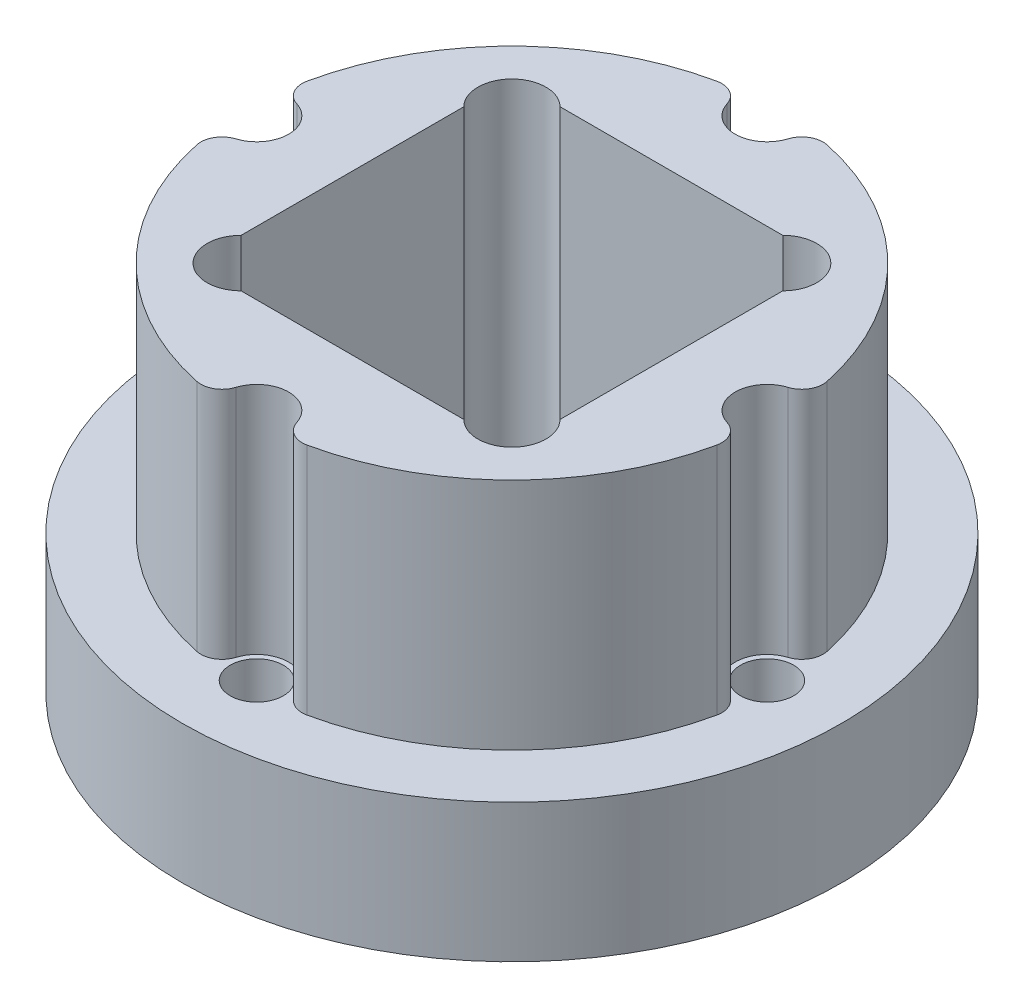
ISO-10303-21;
HEADER;
FILE_DESCRIPTION(('STEP AP214'),'2;1');
FILE_NAME('part.step','',(''),(''),'','','');
FILE_SCHEMA(('AUTOMOTIVE_DESIGN { 1 0 10303 214 1 1 1 1 }'));
ENDSEC;
DATA;
#1=APPLICATION_CONTEXT('core data for automotive mechanical design processes');
#2=APPLICATION_PROTOCOL_DEFINITION('international standard','automotive_design',2000,#1);
#3=PRODUCT_CONTEXT('',#1,'mechanical');
#4=PRODUCT('Part','Part','',(#3));
#5=PRODUCT_RELATED_PRODUCT_CATEGORY('part','',(#4));
#6=PRODUCT_DEFINITION_FORMATION('','',#4);
#7=PRODUCT_DEFINITION_CONTEXT('part definition',#1,'design');
#8=PRODUCT_DEFINITION('design','',#6,#7);
#9=PRODUCT_DEFINITION_SHAPE('','',#8);
#10=(LENGTH_UNIT() NAMED_UNIT(*) SI_UNIT(.MILLI.,.METRE.));
#11=(NAMED_UNIT(*) PLANE_ANGLE_UNIT() SI_UNIT($,.RADIAN.));
#12=(NAMED_UNIT(*) SI_UNIT($,.STERADIAN.) SOLID_ANGLE_UNIT());
#13=UNCERTAINTY_MEASURE_WITH_UNIT(LENGTH_MEASURE(1.E-05),#10,'distance_accuracy_value','');
#14=(GEOMETRIC_REPRESENTATION_CONTEXT(3) GLOBAL_UNCERTAINTY_ASSIGNED_CONTEXT((#13)) GLOBAL_UNIT_ASSIGNED_CONTEXT((#10,
#11,#12)) REPRESENTATION_CONTEXT('',''));
#15=CARTESIAN_POINT('',(0.,0.,0.));
#16=DIRECTION('',(0.,0.,1.));
#17=DIRECTION('',(1.,0.,0.));
#18=AXIS2_PLACEMENT_3D('',#15,#16,#17);
#19=CARTESIAN_POINT('',(0.,0.,0.));
#20=DIRECTION('',(0.,1.,0.));
#21=DIRECTION('',(0.,0.,1.));
#22=AXIS2_PLACEMENT_3D('',#19,#20,#21);
#23=PLANE('',#22);
#24=CARTESIAN_POINT('',(0.,0.,-12.));
#25=DIRECTION('',(0.,-1.,0.));
#26=DIRECTION('',(0.,0.,-1.));
#27=AXIS2_PLACEMENT_3D('',#24,#25,#26);
#28=CIRCLE('',#27,1.25);
#29=CARTESIAN_POINT('',(0.,0.,-13.25));
#30=VERTEX_POINT('',#29);
#31=EDGE_CURVE('E501',#30,#30,#28,.T.);
#32=ORIENTED_EDGE('',*,*,#31,.F.);
#33=EDGE_LOOP('',(#32));
#34=FACE_BOUND('',#33,.T.);
#35=CARTESIAN_POINT('',(12.,0.,0.));
#36=DIRECTION('',(0.,-1.,0.));
#37=DIRECTION('',(0.,0.,-1.));
#38=AXIS2_PLACEMENT_3D('',#35,#36,#37);
#39=CIRCLE('',#38,1.25);
#40=CARTESIAN_POINT('',(12.,0.,-1.25));
#41=VERTEX_POINT('',#40);
#42=EDGE_CURVE('E507',#41,#41,#39,.T.);
#43=ORIENTED_EDGE('',*,*,#42,.F.);
#44=EDGE_LOOP('',(#43));
#45=FACE_BOUND('',#44,.T.);
#46=CARTESIAN_POINT('',(0.,0.,12.));
#47=DIRECTION('',(0.,-1.,0.));
#48=DIRECTION('',(0.,0.,-1.));
#49=AXIS2_PLACEMENT_3D('',#46,#47,#48);
#50=CIRCLE('',#49,1.25);
#51=CARTESIAN_POINT('',(0.,0.,10.75));
#52=VERTEX_POINT('',#51);
#53=EDGE_CURVE('E512',#52,#52,#50,.T.);
#54=ORIENTED_EDGE('',*,*,#53,.F.);
#55=EDGE_LOOP('',(#54));
#56=FACE_BOUND('',#55,.T.);
#57=CARTESIAN_POINT('',(6.36862915010152,0.,-6.36862915010152));
#58=DIRECTION('',(0.,1.,0.));
#59=DIRECTION('',(0.,0.,1.));
#60=AXIS2_PLACEMENT_3D('',#57,#58,#59);
#61=CIRCLE('',#60,1.6);
#62=CARTESIAN_POINT('',(7.5,0.,-5.23725830020305));
#63=VERTEX_POINT('',#62);
#64=CARTESIAN_POINT('',(5.23725830020305,0.,-7.5));
#65=VERTEX_POINT('',#64);
#66=EDGE_CURVE('E328',#63,#65,#61,.T.);
#67=ORIENTED_EDGE('',*,*,#66,.T.);
#68=DIRECTION('',(1.,0.,0.));
#69=VECTOR('',#68,1.);
#70=CARTESIAN_POINT('',(0.,0.,-7.5));
#71=LINE('',#70,#69);
#72=CARTESIAN_POINT('',(-5.23725830020305,0.,-7.5));
#73=VERTEX_POINT('',#72);
#74=EDGE_CURVE('E313',#73,#65,#71,.T.);
#75=ORIENTED_EDGE('',*,*,#74,.F.);
#76=CARTESIAN_POINT('',(-6.36862915010152,0.,-6.36862915010152));
#77=DIRECTION('',(0.,1.,0.));
#78=DIRECTION('',(0.,0.,1.));
#79=AXIS2_PLACEMENT_3D('',#76,#77,#78);
#80=CIRCLE('',#79,1.6);
#81=CARTESIAN_POINT('',(-7.5,0.,-5.23725830020305));
#82=VERTEX_POINT('',#81);
#83=EDGE_CURVE('E327',#73,#82,#80,.T.);
#84=ORIENTED_EDGE('',*,*,#83,.T.);
#85=DIRECTION('',(0.,0.,-1.));
#86=VECTOR('',#85,1.);
#87=CARTESIAN_POINT('',(-7.5,0.,0.));
#88=LINE('',#87,#86);
#89=CARTESIAN_POINT('',(-7.5,0.,5.23725830020305));
#90=VERTEX_POINT('',#89);
#91=EDGE_CURVE('E352',#90,#82,#88,.T.);
#92=ORIENTED_EDGE('',*,*,#91,.F.);
#93=CARTESIAN_POINT('',(-6.36862915010152,0.,6.36862915010152));
#94=DIRECTION('',(0.,1.,0.));
#95=DIRECTION('',(0.,0.,1.));
#96=AXIS2_PLACEMENT_3D('',#93,#94,#95);
#97=CIRCLE('',#96,1.6);
#98=CARTESIAN_POINT('',(-5.23725830020305,0.,7.5));
#99=VERTEX_POINT('',#98);
#100=EDGE_CURVE('E373',#90,#99,#97,.T.);
#101=ORIENTED_EDGE('',*,*,#100,.T.);
#102=DIRECTION('',(1.,0.,0.));
#103=VECTOR('',#102,1.);
#104=CARTESIAN_POINT('',(0.,0.,7.5));
#105=LINE('',#104,#103);
#106=CARTESIAN_POINT('',(5.23725830020305,0.,7.5));
#107=VERTEX_POINT('',#106);
#108=EDGE_CURVE('E341',#99,#107,#105,.T.);
#109=ORIENTED_EDGE('',*,*,#108,.T.);
#110=CARTESIAN_POINT('',(6.36862915010152,0.,6.36862915010152));
#111=DIRECTION('',(0.,1.,0.));
#112=DIRECTION('',(0.,0.,1.));
#113=AXIS2_PLACEMENT_3D('',#110,#111,#112);
#114=CIRCLE('',#113,1.6);
#115=CARTESIAN_POINT('',(7.5,0.,5.23725830020305));
#116=VERTEX_POINT('',#115);
#117=EDGE_CURVE('E379',#107,#116,#114,.T.);
#118=ORIENTED_EDGE('',*,*,#117,.T.);
#119=DIRECTION('',(0.,0.,-1.));
#120=VECTOR('',#119,1.);
#121=CARTESIAN_POINT('',(7.5,0.,0.));
#122=LINE('',#121,#120);
#123=EDGE_CURVE('E336',#116,#63,#122,.T.);
#124=ORIENTED_EDGE('',*,*,#123,.T.);
#125=EDGE_LOOP('',(#67,#75,#84,#92,#101,#109,#118,#124));
#126=FACE_BOUND('',#125,.T.);
#127=CARTESIAN_POINT('',(0.,0.,0.));
#128=DIRECTION('',(0.,1.,0.));
#129=DIRECTION('',(0.,0.,1.));
#130=AXIS2_PLACEMENT_3D('',#127,#128,#129);
#131=CIRCLE('',#130,15.5);
#132=CARTESIAN_POINT('',(0.,0.,15.5));
#133=VERTEX_POINT('',#132);
#134=EDGE_CURVE('E399',#133,#133,#131,.T.);
#135=ORIENTED_EDGE('',*,*,#134,.F.);
#136=EDGE_LOOP('',(#135));
#137=FACE_BOUND('',#136,.T.);
#138=CARTESIAN_POINT('',(-12.,0.,0.));
#139=DIRECTION('',(0.,-1.,0.));
#140=DIRECTION('',(0.,0.,-1.));
#141=AXIS2_PLACEMENT_3D('',#138,#139,#140);
#142=CIRCLE('',#141,1.25);
#143=CARTESIAN_POINT('',(-12.,0.,-1.25));
#144=VERTEX_POINT('',#143);
#145=EDGE_CURVE('E494',#144,#144,#142,.T.);
#146=ORIENTED_EDGE('',*,*,#145,.F.);
#147=EDGE_LOOP('',(#146));
#148=FACE_BOUND('',#147,.T.);
#149=ADVANCED_FACE('F146',(#34,#45,#56,#126,#137,#148),#23,.F.);
#150=CARTESIAN_POINT('',(0.,25.6072581060629,0.));
#151=DIRECTION('',(0.,1.,0.));
#152=DIRECTION('',(0.,0.,1.));
#153=AXIS2_PLACEMENT_3D('',#150,#151,#152);
#154=CYLINDRICAL_SURFACE('',#153,12.5);
#155=CARTESIAN_POINT('',(0.,17.5,0.));
#156=DIRECTION('',(0.,1.,0.));
#157=DIRECTION('',(0.,0.,1.));
#158=AXIS2_PLACEMENT_3D('',#155,#156,#157);
#159=CIRCLE('',#158,12.5);
#160=CARTESIAN_POINT('',(-12.2282608695652,17.5,2.5922260908069));
#161=VERTEX_POINT('',#160);
#162=CARTESIAN_POINT('',(-2.59222609080692,17.5,12.2282608695652));
#163=VERTEX_POINT('',#162);
#164=EDGE_CURVE('E317',#161,#163,#159,.T.);
#165=ORIENTED_EDGE('',*,*,#164,.F.);
#166=DIRECTION('',(0.,1.,0.));
#167=VECTOR('',#166,1.);
#168=CARTESIAN_POINT('',(-12.2282608695652,25.6072581060629,2.5922260908069));
#169=LINE('',#168,#167);
#170=CARTESIAN_POINT('',(-12.2282608695652,6.5,2.5922260908069));
#171=VERTEX_POINT('',#170);
#172=EDGE_CURVE('E451',#161,#171,#169,.F.);
#173=ORIENTED_EDGE('',*,*,#172,.T.);
#174=CARTESIAN_POINT('',(0.,6.5,0.));
#175=DIRECTION('',(0.,1.,0.));
#176=DIRECTION('',(0.,0.,1.));
#177=AXIS2_PLACEMENT_3D('',#174,#175,#176);
#178=CIRCLE('',#177,12.5);
#179=CARTESIAN_POINT('',(-2.59222609080691,6.5,12.2282608695652));
#180=VERTEX_POINT('',#179);
#181=EDGE_CURVE('E391',#171,#180,#178,.T.);
#182=ORIENTED_EDGE('',*,*,#181,.T.);
#183=DIRECTION('',(0.,1.,0.));
#184=VECTOR('',#183,1.);
#185=CARTESIAN_POINT('',(-2.59222609080692,25.6072581060629,12.2282608695652));
#186=LINE('',#185,#184);
#187=EDGE_CURVE('E448',#180,#163,#186,.T.);
#188=ORIENTED_EDGE('',*,*,#187,.T.);
#189=EDGE_LOOP('',(#165,#173,#182,#188));
#190=FACE_BOUND('',#189,.T.);
#191=ADVANCED_FACE('F477',(#190),#154,.T.);
#192=CARTESIAN_POINT('',(-2.59222609080692,17.5,-12.2282608695652));
#193=VERTEX_POINT('',#192);
#194=CARTESIAN_POINT('',(-12.2282608695652,17.5,-2.5922260908069));
#195=VERTEX_POINT('',#194);
#196=EDGE_CURVE('E390',#193,#195,#159,.T.);
#197=ORIENTED_EDGE('',*,*,#196,.F.);
#198=DIRECTION('',(0.,1.,0.));
#199=VECTOR('',#198,1.);
#200=CARTESIAN_POINT('',(-2.59222609080692,25.6072581060629,-12.2282608695652));
#201=LINE('',#200,#199);
#202=CARTESIAN_POINT('',(-2.59222609080692,6.5,-12.2282608695652));
#203=VERTEX_POINT('',#202);
#204=EDGE_CURVE('E441',#193,#203,#201,.F.);
#205=ORIENTED_EDGE('',*,*,#204,.T.);
#206=CARTESIAN_POINT('',(-12.2282608695652,6.5,-2.5922260908069));
#207=VERTEX_POINT('',#206);
#208=EDGE_CURVE('E394',#203,#207,#178,.T.);
#209=ORIENTED_EDGE('',*,*,#208,.T.);
#210=DIRECTION('',(0.,1.,0.));
#211=VECTOR('',#210,1.);
#212=CARTESIAN_POINT('',(-12.2282608695652,25.6072581060629,-2.5922260908069));
#213=LINE('',#212,#211);
#214=EDGE_CURVE('E438',#207,#195,#213,.T.);
#215=ORIENTED_EDGE('',*,*,#214,.T.);
#216=EDGE_LOOP('',(#197,#205,#209,#215));
#217=FACE_BOUND('',#216,.T.);
#218=ADVANCED_FACE('F543',(#217),#154,.T.);
#219=CARTESIAN_POINT('',(12.2282608695652,17.5,-2.59222609080691));
#220=VERTEX_POINT('',#219);
#221=CARTESIAN_POINT('',(2.59222609080691,17.5,-12.2282608695652));
#222=VERTEX_POINT('',#221);
#223=EDGE_CURVE('E386',#220,#222,#159,.T.);
#224=ORIENTED_EDGE('',*,*,#223,.F.);
#225=DIRECTION('',(0.,1.,0.));
#226=VECTOR('',#225,1.);
#227=CARTESIAN_POINT('',(12.2282608695652,25.6072581060629,-2.59222609080691));
#228=LINE('',#227,#226);
#229=CARTESIAN_POINT('',(12.2282608695652,6.5,-2.59222609080691));
#230=VERTEX_POINT('',#229);
#231=EDGE_CURVE('E431',#220,#230,#228,.F.);
#232=ORIENTED_EDGE('',*,*,#231,.T.);
#233=CARTESIAN_POINT('',(2.59222609080691,6.5,-12.2282608695652));
#234=VERTEX_POINT('',#233);
#235=EDGE_CURVE('E628',#230,#234,#178,.T.);
#236=ORIENTED_EDGE('',*,*,#235,.T.);
#237=DIRECTION('',(0.,1.,0.));
#238=VECTOR('',#237,1.);
#239=CARTESIAN_POINT('',(2.59222609080691,25.6072581060629,-12.2282608695652));
#240=LINE('',#239,#238);
#241=EDGE_CURVE('E428',#234,#222,#240,.T.);
#242=ORIENTED_EDGE('',*,*,#241,.T.);
#243=EDGE_LOOP('',(#224,#232,#236,#242));
#244=FACE_BOUND('',#243,.T.);
#245=ADVANCED_FACE('F627',(#244),#154,.T.);
#246=CARTESIAN_POINT('',(0.,25.6072581060629,0.));
#247=DIRECTION('',(0.,1.,0.));
#248=DIRECTION('',(0.,0.,1.));
#249=AXIS2_PLACEMENT_3D('',#246,#247,#248);
#250=CYLINDRICAL_SURFACE('',#249,15.5);
#251=CARTESIAN_POINT('',(0.,6.5,0.));
#252=DIRECTION('',(0.,1.,0.));
#253=DIRECTION('',(0.,0.,1.));
#254=AXIS2_PLACEMENT_3D('',#251,#252,#253);
#255=CIRCLE('',#254,15.5);
#256=CARTESIAN_POINT('',(0.,6.5,15.5));
#257=VERTEX_POINT('',#256);
#258=EDGE_CURVE('E396',#257,#257,#255,.T.);
#259=ORIENTED_EDGE('',*,*,#258,.F.);
#260=EDGE_LOOP('',(#259));
#261=FACE_BOUND('',#260,.T.);
#262=ORIENTED_EDGE('',*,*,#134,.T.);
#263=EDGE_LOOP('',(#262));
#264=FACE_BOUND('',#263,.T.);
#265=ADVANCED_FACE('F550',(#261,#264),#250,.T.);
#266=CARTESIAN_POINT('',(0.,6.5,-15.5));
#267=DIRECTION('',(0.,-1.,0.));
#268=DIRECTION('',(0.,0.,-1.));
#269=AXIS2_PLACEMENT_3D('',#266,#267,#268);
#270=PLANE('',#269);
#271=ORIENTED_EDGE('',*,*,#181,.F.);
#272=CARTESIAN_POINT('',(-11.25,6.5,2.38484800354235));
#273=DIRECTION('',(0.,-1.,0.));
#274=DIRECTION('',(0.,0.,-1.));
#275=AXIS2_PLACEMENT_3D('',#272,#273,#274);
#276=CIRCLE('',#275,1.);
#277=CARTESIAN_POINT('',(-11.55,6.5,1.43090880212541));
#278=VERTEX_POINT('',#277);
#279=EDGE_CURVE('E467',#171,#278,#276,.T.);
#280=ORIENTED_EDGE('',*,*,#279,.T.);
#281=CARTESIAN_POINT('',(-12.,6.5,0.));
#282=DIRECTION('',(0.,-1.,0.));
#283=DIRECTION('',(0.,0.,-1.));
#284=AXIS2_PLACEMENT_3D('',#281,#282,#283);
#285=CIRCLE('',#284,1.5);
#286=CARTESIAN_POINT('',(-11.55,6.5,-1.43090880212541));
#287=VERTEX_POINT('',#286);
#288=EDGE_CURVE('E498',#278,#287,#285,.F.);
#289=ORIENTED_EDGE('',*,*,#288,.T.);
#290=CARTESIAN_POINT('',(-11.25,6.5,-2.38484800354235));
#291=DIRECTION('',(0.,-1.,0.));
#292=DIRECTION('',(0.,0.,-1.));
#293=AXIS2_PLACEMENT_3D('',#290,#291,#292);
#294=CIRCLE('',#293,1.);
#295=EDGE_CURVE('E465',#287,#207,#294,.T.);
#296=ORIENTED_EDGE('',*,*,#295,.T.);
#297=ORIENTED_EDGE('',*,*,#208,.F.);
#298=CARTESIAN_POINT('',(-2.38484800354237,6.5,-11.25));
#299=DIRECTION('',(0.,-1.,0.));
#300=DIRECTION('',(0.,0.,-1.));
#301=AXIS2_PLACEMENT_3D('',#298,#299,#300);
#302=CIRCLE('',#301,1.);
#303=CARTESIAN_POINT('',(-1.43090880212542,6.5,-11.55));
#304=VERTEX_POINT('',#303);
#305=EDGE_CURVE('E463',#203,#304,#302,.T.);
#306=ORIENTED_EDGE('',*,*,#305,.T.);
#307=CARTESIAN_POINT('',(0.,6.5,-12.));
#308=DIRECTION('',(0.,-1.,0.));
#309=DIRECTION('',(0.,0.,-1.));
#310=AXIS2_PLACEMENT_3D('',#307,#308,#309);
#311=CIRCLE('',#310,1.5);
#312=CARTESIAN_POINT('',(1.43090880212541,6.5,-11.55));
#313=VERTEX_POINT('',#312);
#314=EDGE_CURVE('E601',#304,#313,#311,.F.);
#315=ORIENTED_EDGE('',*,*,#314,.T.);
#316=CARTESIAN_POINT('',(2.38484800354236,6.5,-11.25));
#317=DIRECTION('',(0.,-1.,0.));
#318=DIRECTION('',(0.,0.,-1.));
#319=AXIS2_PLACEMENT_3D('',#316,#317,#318);
#320=CIRCLE('',#319,1.);
#321=EDGE_CURVE('E461',#313,#234,#320,.T.);
#322=ORIENTED_EDGE('',*,*,#321,.T.);
#323=ORIENTED_EDGE('',*,*,#235,.F.);
#324=CARTESIAN_POINT('',(11.25,6.5,-2.38484800354235));
#325=DIRECTION('',(0.,-1.,0.));
#326=DIRECTION('',(0.,0.,-1.));
#327=AXIS2_PLACEMENT_3D('',#324,#325,#326);
#328=CIRCLE('',#327,1.);
#329=CARTESIAN_POINT('',(11.55,6.5,-1.43090880212542));
#330=VERTEX_POINT('',#329);
#331=EDGE_CURVE('E459',#230,#330,#328,.T.);
#332=ORIENTED_EDGE('',*,*,#331,.T.);
#333=CARTESIAN_POINT('',(12.,6.5,0.));
#334=DIRECTION('',(0.,-1.,0.));
#335=DIRECTION('',(0.,0.,-1.));
#336=AXIS2_PLACEMENT_3D('',#333,#334,#335);
#337=CIRCLE('',#336,1.5);
#338=CARTESIAN_POINT('',(11.55,6.5,1.43090880212541));
#339=VERTEX_POINT('',#338);
#340=EDGE_CURVE('E491',#330,#339,#337,.F.);
#341=ORIENTED_EDGE('',*,*,#340,.T.);
#342=CARTESIAN_POINT('',(11.25,6.5,2.38484800354235));
#343=DIRECTION('',(0.,-1.,0.));
#344=DIRECTION('',(0.,0.,-1.));
#345=AXIS2_PLACEMENT_3D('',#342,#343,#344);
#346=CIRCLE('',#345,1.);
#347=CARTESIAN_POINT('',(12.2282608695652,6.5,2.5922260908069));
#348=VERTEX_POINT('',#347);
#349=EDGE_CURVE('E457',#339,#348,#346,.T.);
#350=ORIENTED_EDGE('',*,*,#349,.T.);
#351=CARTESIAN_POINT('',(2.59222609080692,6.5,12.2282608695652));
#352=VERTEX_POINT('',#351);
#353=EDGE_CURVE('E395',#352,#348,#178,.T.);
#354=ORIENTED_EDGE('',*,*,#353,.F.);
#355=CARTESIAN_POINT('',(2.38484800354237,6.5,11.25));
#356=DIRECTION('',(0.,-1.,0.));
#357=DIRECTION('',(0.,0.,-1.));
#358=AXIS2_PLACEMENT_3D('',#355,#356,#357);
#359=CIRCLE('',#358,1.);
#360=CARTESIAN_POINT('',(1.43090880212542,6.5,11.55));
#361=VERTEX_POINT('',#360);
#362=EDGE_CURVE('E12',#352,#361,#359,.T.);
#363=ORIENTED_EDGE('',*,*,#362,.T.);
#364=CARTESIAN_POINT('',(0.,6.5,12.));
#365=DIRECTION('',(0.,-1.,0.));
#366=DIRECTION('',(0.,0.,-1.));
#367=AXIS2_PLACEMENT_3D('',#364,#365,#366);
#368=CIRCLE('',#367,1.5);
#369=CARTESIAN_POINT('',(-1.43090880212541,6.5,11.55));
#370=VERTEX_POINT('',#369);
#371=EDGE_CURVE('E472',#361,#370,#368,.F.);
#372=ORIENTED_EDGE('',*,*,#371,.T.);
#373=CARTESIAN_POINT('',(-2.38484800354236,6.5,11.25));
#374=DIRECTION('',(0.,-1.,0.));
#375=DIRECTION('',(0.,0.,-1.));
#376=AXIS2_PLACEMENT_3D('',#373,#374,#375);
#377=CIRCLE('',#376,1.);
#378=EDGE_CURVE('E154',#370,#180,#377,.T.);
#379=ORIENTED_EDGE('',*,*,#378,.T.);
#380=EDGE_LOOP('',(#271,#280,#289,#296,#297,#306,#315,#322,#323,#332,#341,#350,#354,#363,#372,#379));
#381=FACE_BOUND('',#380,.T.);
#382=CARTESIAN_POINT('',(-12.,6.5,0.));
#383=DIRECTION('',(0.,-1.,0.));
#384=DIRECTION('',(0.,0.,-1.));
#385=AXIS2_PLACEMENT_3D('',#382,#383,#384);
#386=CIRCLE('',#385,1.25);
#387=CARTESIAN_POINT('',(-12.,6.5,-1.25));
#388=VERTEX_POINT('',#387);
#389=EDGE_CURVE('E497',#388,#388,#386,.T.);
#390=ORIENTED_EDGE('',*,*,#389,.T.);
#391=EDGE_LOOP('',(#390));
#392=FACE_BOUND('',#391,.T.);
#393=CARTESIAN_POINT('',(0.,6.5,12.));
#394=DIRECTION('',(0.,-1.,0.));
#395=DIRECTION('',(0.,0.,-1.));
#396=AXIS2_PLACEMENT_3D('',#393,#394,#395);
#397=CIRCLE('',#396,1.25);
#398=CARTESIAN_POINT('',(0.,6.5,10.75));
#399=VERTEX_POINT('',#398);
#400=EDGE_CURVE('E344',#399,#399,#397,.T.);
#401=ORIENTED_EDGE('',*,*,#400,.T.);
#402=EDGE_LOOP('',(#401));
#403=FACE_BOUND('',#402,.T.);
#404=CARTESIAN_POINT('',(0.,6.5,-12.));
#405=DIRECTION('',(0.,-1.,0.));
#406=DIRECTION('',(0.,0.,-1.));
#407=AXIS2_PLACEMENT_3D('',#404,#405,#406);
#408=CIRCLE('',#407,1.25);
#409=CARTESIAN_POINT('',(0.,6.5,-13.25));
#410=VERTEX_POINT('',#409);
#411=EDGE_CURVE('E504',#410,#410,#408,.T.);
#412=ORIENTED_EDGE('',*,*,#411,.T.);
#413=EDGE_LOOP('',(#412));
#414=FACE_BOUND('',#413,.T.);
#415=CARTESIAN_POINT('',(12.,6.5,0.));
#416=DIRECTION('',(0.,-1.,0.));
#417=DIRECTION('',(0.,0.,-1.));
#418=AXIS2_PLACEMENT_3D('',#415,#416,#417);
#419=CIRCLE('',#418,1.25);
#420=CARTESIAN_POINT('',(12.,6.5,-1.25));
#421=VERTEX_POINT('',#420);
#422=EDGE_CURVE('E510',#421,#421,#419,.T.);
#423=ORIENTED_EDGE('',*,*,#422,.T.);
#424=EDGE_LOOP('',(#423));
#425=FACE_BOUND('',#424,.T.);
#426=ORIENTED_EDGE('',*,*,#258,.T.);
#427=EDGE_LOOP('',(#426));
#428=FACE_BOUND('',#427,.T.);
#429=ADVANCED_FACE('F470',(#381,#392,#403,#414,#425,#428),#270,.F.);
#430=ORIENTED_EDGE('',*,*,#353,.T.);
#431=DIRECTION('',(0.,1.,0.));
#432=VECTOR('',#431,1.);
#433=CARTESIAN_POINT('',(12.2282608695652,25.6072581060629,2.5922260908069));
#434=LINE('',#433,#432);
#435=CARTESIAN_POINT('',(12.2282608695652,17.5,2.5922260908069));
#436=VERTEX_POINT('',#435);
#437=EDGE_CURVE('E405',#348,#436,#434,.T.);
#438=ORIENTED_EDGE('',*,*,#437,.T.);
#439=CARTESIAN_POINT('',(2.59222609080692,17.5,12.2282608695652));
#440=VERTEX_POINT('',#439);
#441=EDGE_CURVE('E389',#440,#436,#159,.T.);
#442=ORIENTED_EDGE('',*,*,#441,.F.);
#443=DIRECTION('',(0.,1.,0.));
#444=VECTOR('',#443,1.);
#445=CARTESIAN_POINT('',(2.59222609080692,25.6072581060629,12.2282608695652));
#446=LINE('',#445,#444);
#447=EDGE_CURVE('E402',#440,#352,#446,.F.);
#448=ORIENTED_EDGE('',*,*,#447,.T.);
#449=EDGE_LOOP('',(#430,#438,#442,#448));
#450=FACE_BOUND('',#449,.T.);
#451=ADVANCED_FACE('F545',(#450),#154,.T.);
#452=CARTESIAN_POINT('',(0.,17.5,-12.5));
#453=DIRECTION('',(0.,-1.,0.));
#454=DIRECTION('',(0.,0.,-1.));
#455=AXIS2_PLACEMENT_3D('',#452,#453,#454);
#456=PLANE('',#455);
#457=CARTESIAN_POINT('',(6.36862915010152,17.5,-6.36862915010152));
#458=DIRECTION('',(0.,1.,0.));
#459=DIRECTION('',(0.,0.,1.));
#460=AXIS2_PLACEMENT_3D('',#457,#458,#459);
#461=CIRCLE('',#460,1.6);
#462=CARTESIAN_POINT('',(7.5,17.5,-5.23725830020305));
#463=VERTEX_POINT('',#462);
#464=CARTESIAN_POINT('',(5.23725830020305,17.5,-7.5));
#465=VERTEX_POINT('',#464);
#466=EDGE_CURVE('E321',#463,#465,#461,.T.);
#467=ORIENTED_EDGE('',*,*,#466,.F.);
#468=DIRECTION('',(0.,0.,-1.));
#469=VECTOR('',#468,1.);
#470=CARTESIAN_POINT('',(7.5,17.5,0.));
#471=LINE('',#470,#469);
#472=CARTESIAN_POINT('',(7.5,17.5,5.23725830020305));
#473=VERTEX_POINT('',#472);
#474=EDGE_CURVE('E349',#473,#463,#471,.T.);
#475=ORIENTED_EDGE('',*,*,#474,.F.);
#476=CARTESIAN_POINT('',(6.36862915010152,17.5,6.36862915010152));
#477=DIRECTION('',(0.,1.,0.));
#478=DIRECTION('',(0.,0.,1.));
#479=AXIS2_PLACEMENT_3D('',#476,#477,#478);
#480=CIRCLE('',#479,1.6);
#481=CARTESIAN_POINT('',(5.23725830020305,17.5,7.5));
#482=VERTEX_POINT('',#481);
#483=EDGE_CURVE('E376',#482,#473,#480,.T.);
#484=ORIENTED_EDGE('',*,*,#483,.F.);
#485=DIRECTION('',(1.,0.,0.));
#486=VECTOR('',#485,1.);
#487=CARTESIAN_POINT('',(0.,17.5,7.5));
#488=LINE('',#487,#486);
#489=CARTESIAN_POINT('',(-5.23725830020305,17.5,7.5));
#490=VERTEX_POINT('',#489);
#491=EDGE_CURVE('E338',#490,#482,#488,.T.);
#492=ORIENTED_EDGE('',*,*,#491,.F.);
#493=CARTESIAN_POINT('',(-6.36862915010152,17.5,6.36862915010152));
#494=DIRECTION('',(0.,1.,0.));
#495=DIRECTION('',(0.,0.,1.));
#496=AXIS2_PLACEMENT_3D('',#493,#494,#495);
#497=CIRCLE('',#496,1.6);
#498=CARTESIAN_POINT('',(-7.5,17.5,5.23725830020305));
#499=VERTEX_POINT('',#498);
#500=EDGE_CURVE('E353',#499,#490,#497,.T.);
#501=ORIENTED_EDGE('',*,*,#500,.F.);
#502=DIRECTION('',(0.,0.,-1.));
#503=VECTOR('',#502,1.);
#504=CARTESIAN_POINT('',(-7.5,17.5,0.));
#505=LINE('',#504,#503);
#506=CARTESIAN_POINT('',(-7.5,17.5,-5.23725830020305));
#507=VERTEX_POINT('',#506);
#508=EDGE_CURVE('E335',#499,#507,#505,.T.);
#509=ORIENTED_EDGE('',*,*,#508,.T.);
#510=CARTESIAN_POINT('',(-6.36862915010152,17.5,-6.36862915010152));
#511=DIRECTION('',(0.,1.,0.));
#512=DIRECTION('',(0.,0.,1.));
#513=AXIS2_PLACEMENT_3D('',#510,#511,#512);
#514=CIRCLE('',#513,1.6);
#515=CARTESIAN_POINT('',(-5.23725830020305,17.5,-7.5));
#516=VERTEX_POINT('',#515);
#517=EDGE_CURVE('E334',#516,#507,#514,.T.);
#518=ORIENTED_EDGE('',*,*,#517,.F.);
#519=DIRECTION('',(1.,0.,0.));
#520=VECTOR('',#519,1.);
#521=CARTESIAN_POINT('',(0.,17.5,-7.5));
#522=LINE('',#521,#520);
#523=EDGE_CURVE('E310',#516,#465,#522,.T.);
#524=ORIENTED_EDGE('',*,*,#523,.T.);
#525=EDGE_LOOP('',(#467,#475,#484,#492,#501,#509,#518,#524));
#526=FACE_BOUND('',#525,.T.);
#527=ORIENTED_EDGE('',*,*,#441,.T.);
#528=CARTESIAN_POINT('',(11.25,17.5,2.38484800354235));
#529=DIRECTION('',(0.,-1.,0.));
#530=DIRECTION('',(0.,0.,-1.));
#531=AXIS2_PLACEMENT_3D('',#528,#529,#530);
#532=CIRCLE('',#531,1.);
#533=CARTESIAN_POINT('',(11.55,17.5,1.43090880212541));
#534=VERTEX_POINT('',#533);
#535=EDGE_CURVE('E422',#436,#534,#532,.F.);
#536=ORIENTED_EDGE('',*,*,#535,.T.);
#537=CARTESIAN_POINT('',(12.,17.5,0.));
#538=DIRECTION('',(0.,1.,0.));
#539=DIRECTION('',(0.,0.,1.));
#540=AXIS2_PLACEMENT_3D('',#537,#538,#539);
#541=CIRCLE('',#540,1.5);
#542=CARTESIAN_POINT('',(11.55,17.5,-1.43090880212542));
#543=VERTEX_POINT('',#542);
#544=EDGE_CURVE('E488',#543,#534,#541,.T.);
#545=ORIENTED_EDGE('',*,*,#544,.F.);
#546=CARTESIAN_POINT('',(11.25,17.5,-2.38484800354235));
#547=DIRECTION('',(0.,-1.,0.));
#548=DIRECTION('',(0.,0.,-1.));
#549=AXIS2_PLACEMENT_3D('',#546,#547,#548);
#550=CIRCLE('',#549,1.);
#551=EDGE_CURVE('E420',#543,#220,#550,.F.);
#552=ORIENTED_EDGE('',*,*,#551,.T.);
#553=ORIENTED_EDGE('',*,*,#223,.T.);
#554=CARTESIAN_POINT('',(2.38484800354236,17.5,-11.25));
#555=DIRECTION('',(0.,-1.,0.));
#556=DIRECTION('',(0.,0.,-1.));
#557=AXIS2_PLACEMENT_3D('',#554,#555,#556);
#558=CIRCLE('',#557,1.);
#559=CARTESIAN_POINT('',(1.43090880212541,17.5,-11.55));
#560=VERTEX_POINT('',#559);
#561=EDGE_CURVE('E418',#222,#560,#558,.F.);
#562=ORIENTED_EDGE('',*,*,#561,.T.);
#563=CARTESIAN_POINT('',(0.,17.5,-12.));
#564=DIRECTION('',(0.,1.,0.));
#565=DIRECTION('',(0.,0.,1.));
#566=AXIS2_PLACEMENT_3D('',#563,#564,#565);
#567=CIRCLE('',#566,1.5);
#568=CARTESIAN_POINT('',(-1.43090880212542,17.5,-11.55));
#569=VERTEX_POINT('',#568);
#570=EDGE_CURVE('E608',#569,#560,#567,.T.);
#571=ORIENTED_EDGE('',*,*,#570,.F.);
#572=CARTESIAN_POINT('',(-2.38484800354237,17.5,-11.25));
#573=DIRECTION('',(0.,-1.,0.));
#574=DIRECTION('',(0.,0.,-1.));
#575=AXIS2_PLACEMENT_3D('',#572,#573,#574);
#576=CIRCLE('',#575,1.);
#577=EDGE_CURVE('E416',#569,#193,#576,.F.);
#578=ORIENTED_EDGE('',*,*,#577,.T.);
#579=ORIENTED_EDGE('',*,*,#196,.T.);
#580=CARTESIAN_POINT('',(-11.25,17.5,-2.38484800354235));
#581=DIRECTION('',(0.,-1.,0.));
#582=DIRECTION('',(0.,0.,-1.));
#583=AXIS2_PLACEMENT_3D('',#580,#581,#582);
#584=CIRCLE('',#583,1.);
#585=CARTESIAN_POINT('',(-11.55,17.5,-1.43090880212541));
#586=VERTEX_POINT('',#585);
#587=EDGE_CURVE('E414',#195,#586,#584,.F.);
#588=ORIENTED_EDGE('',*,*,#587,.T.);
#589=CARTESIAN_POINT('',(-12.,17.5,0.));
#590=DIRECTION('',(0.,1.,0.));
#591=DIRECTION('',(0.,0.,1.));
#592=AXIS2_PLACEMENT_3D('',#589,#590,#591);
#593=CIRCLE('',#592,1.5);
#594=CARTESIAN_POINT('',(-11.55,17.5,1.43090880212541));
#595=VERTEX_POINT('',#594);
#596=EDGE_CURVE('E607',#595,#586,#593,.T.);
#597=ORIENTED_EDGE('',*,*,#596,.F.);
#598=CARTESIAN_POINT('',(-11.25,17.5,2.38484800354235));
#599=DIRECTION('',(0.,-1.,0.));
#600=DIRECTION('',(0.,0.,-1.));
#601=AXIS2_PLACEMENT_3D('',#598,#599,#600);
#602=CIRCLE('',#601,1.);
#603=EDGE_CURVE('E412',#595,#161,#602,.F.);
#604=ORIENTED_EDGE('',*,*,#603,.T.);
#605=ORIENTED_EDGE('',*,*,#164,.T.);
#606=CARTESIAN_POINT('',(-2.38484800354236,17.5,11.25));
#607=DIRECTION('',(0.,-1.,0.));
#608=DIRECTION('',(0.,0.,-1.));
#609=AXIS2_PLACEMENT_3D('',#606,#607,#608);
#610=CIRCLE('',#609,1.);
#611=CARTESIAN_POINT('',(-1.43090880212541,17.5,11.55));
#612=VERTEX_POINT('',#611);
#613=EDGE_CURVE('E410',#163,#612,#610,.F.);
#614=ORIENTED_EDGE('',*,*,#613,.T.);
#615=CARTESIAN_POINT('',(0.,17.5,12.));
#616=DIRECTION('',(0.,1.,0.));
#617=DIRECTION('',(0.,0.,1.));
#618=AXIS2_PLACEMENT_3D('',#615,#616,#617);
#619=CIRCLE('',#618,1.5);
#620=CARTESIAN_POINT('',(1.43090880212542,17.5,11.55));
#621=VERTEX_POINT('',#620);
#622=EDGE_CURVE('E483',#621,#612,#619,.T.);
#623=ORIENTED_EDGE('',*,*,#622,.F.);
#624=CARTESIAN_POINT('',(2.38484800354237,17.5,11.25));
#625=DIRECTION('',(0.,-1.,0.));
#626=DIRECTION('',(0.,0.,-1.));
#627=AXIS2_PLACEMENT_3D('',#624,#625,#626);
#628=CIRCLE('',#627,1.);
#629=EDGE_CURVE('E408',#621,#440,#628,.F.);
#630=ORIENTED_EDGE('',*,*,#629,.T.);
#631=EDGE_LOOP('',(#527,#536,#545,#552,#553,#562,#571,#578,#579,#588,#597,#604,#605,#614,#623,#630));
#632=FACE_BOUND('',#631,.T.);
#633=ADVANCED_FACE('F330',(#526,#632),#456,.F.);
#634=CARTESIAN_POINT('',(0.,17.5,-7.5));
#635=DIRECTION('',(0.,0.,-1.));
#636=DIRECTION('',(-1.,0.,0.));
#637=AXIS2_PLACEMENT_3D('',#634,#635,#636);
#638=PLANE('',#637);
#639=ORIENTED_EDGE('',*,*,#74,.T.);
#640=DIRECTION('',(0.,-1.,0.));
#641=VECTOR('',#640,1.);
#642=CARTESIAN_POINT('',(5.23725830020305,17.5,-7.5));
#643=LINE('',#642,#641);
#644=EDGE_CURVE('E306',#465,#65,#643,.T.);
#645=ORIENTED_EDGE('',*,*,#644,.F.);
#646=ORIENTED_EDGE('',*,*,#523,.F.);
#647=DIRECTION('',(0.,-1.,0.));
#648=VECTOR('',#647,1.);
#649=CARTESIAN_POINT('',(-5.23725830020305,17.5,-7.5));
#650=LINE('',#649,#648);
#651=EDGE_CURVE('E318',#516,#73,#650,.T.);
#652=ORIENTED_EDGE('',*,*,#651,.T.);
#653=EDGE_LOOP('',(#639,#645,#646,#652));
#654=FACE_BOUND('',#653,.T.);
#655=ADVANCED_FACE('F308',(#654),#638,.F.);
#656=CARTESIAN_POINT('',(-7.5,17.5,0.));
#657=DIRECTION('',(-1.,0.,0.));
#658=DIRECTION('',(0.,0.,1.));
#659=AXIS2_PLACEMENT_3D('',#656,#657,#658);
#660=PLANE('',#659);
#661=ORIENTED_EDGE('',*,*,#91,.T.);
#662=DIRECTION('',(0.,-1.,0.));
#663=VECTOR('',#662,1.);
#664=CARTESIAN_POINT('',(-7.5,17.5,-5.23725830020305));
#665=LINE('',#664,#663);
#666=EDGE_CURVE('E368',#507,#82,#665,.T.);
#667=ORIENTED_EDGE('',*,*,#666,.F.);
#668=ORIENTED_EDGE('',*,*,#508,.F.);
#669=DIRECTION('',(0.,-1.,0.));
#670=VECTOR('',#669,1.);
#671=CARTESIAN_POINT('',(-7.5,17.5,5.23725830020305));
#672=LINE('',#671,#670);
#673=EDGE_CURVE('E366',#499,#90,#672,.T.);
#674=ORIENTED_EDGE('',*,*,#673,.T.);
#675=EDGE_LOOP('',(#661,#667,#668,#674));
#676=FACE_BOUND('',#675,.T.);
#677=ADVANCED_FACE('F688',(#676),#660,.F.);
#678=CARTESIAN_POINT('',(0.,17.5,7.5));
#679=DIRECTION('',(0.,0.,-1.));
#680=DIRECTION('',(-1.,0.,0.));
#681=AXIS2_PLACEMENT_3D('',#678,#679,#680);
#682=PLANE('',#681);
#683=ORIENTED_EDGE('',*,*,#108,.F.);
#684=DIRECTION('',(0.,-1.,0.));
#685=VECTOR('',#684,1.);
#686=CARTESIAN_POINT('',(-5.23725830020305,17.5,7.5));
#687=LINE('',#686,#685);
#688=EDGE_CURVE('E363',#490,#99,#687,.T.);
#689=ORIENTED_EDGE('',*,*,#688,.F.);
#690=ORIENTED_EDGE('',*,*,#491,.T.);
#691=DIRECTION('',(0.,-1.,0.));
#692=VECTOR('',#691,1.);
#693=CARTESIAN_POINT('',(5.23725830020305,17.5,7.5));
#694=LINE('',#693,#692);
#695=EDGE_CURVE('E361',#482,#107,#694,.T.);
#696=ORIENTED_EDGE('',*,*,#695,.T.);
#697=EDGE_LOOP('',(#683,#689,#690,#696));
#698=FACE_BOUND('',#697,.T.);
#699=ADVANCED_FACE('F703',(#698),#682,.T.);
#700=CARTESIAN_POINT('',(7.5,17.5,0.));
#701=DIRECTION('',(-1.,0.,0.));
#702=DIRECTION('',(0.,0.,1.));
#703=AXIS2_PLACEMENT_3D('',#700,#701,#702);
#704=PLANE('',#703);
#705=ORIENTED_EDGE('',*,*,#123,.F.);
#706=DIRECTION('',(0.,-1.,0.));
#707=VECTOR('',#706,1.);
#708=CARTESIAN_POINT('',(7.5,17.5,5.23725830020305));
#709=LINE('',#708,#707);
#710=EDGE_CURVE('E359',#473,#116,#709,.T.);
#711=ORIENTED_EDGE('',*,*,#710,.F.);
#712=ORIENTED_EDGE('',*,*,#474,.T.);
#713=DIRECTION('',(0.,-1.,0.));
#714=VECTOR('',#713,1.);
#715=CARTESIAN_POINT('',(7.5,17.5,-5.23725830020305));
#716=LINE('',#715,#714);
#717=EDGE_CURVE('E323',#463,#63,#716,.T.);
#718=ORIENTED_EDGE('',*,*,#717,.T.);
#719=EDGE_LOOP('',(#705,#711,#712,#718));
#720=FACE_BOUND('',#719,.T.);
#721=ADVANCED_FACE('F694',(#720),#704,.T.);
#722=CARTESIAN_POINT('',(6.36862915010152,17.5,-6.36862915010152));
#723=DIRECTION('',(0.,-1.,0.));
#724=DIRECTION('',(0.,0.,-1.));
#725=AXIS2_PLACEMENT_3D('',#722,#723,#724);
#726=CYLINDRICAL_SURFACE('',#725,1.6);
#727=ORIENTED_EDGE('',*,*,#644,.T.);
#728=ORIENTED_EDGE('',*,*,#66,.F.);
#729=ORIENTED_EDGE('',*,*,#717,.F.);
#730=ORIENTED_EDGE('',*,*,#466,.T.);
#731=EDGE_LOOP('',(#727,#728,#729,#730));
#732=FACE_BOUND('',#731,.T.);
#733=ADVANCED_FACE('F322',(#732),#726,.F.);
#734=CARTESIAN_POINT('',(-6.36862915010152,17.5,-6.36862915010152));
#735=DIRECTION('',(0.,-1.,0.));
#736=DIRECTION('',(0.,0.,-1.));
#737=AXIS2_PLACEMENT_3D('',#734,#735,#736);
#738=CYLINDRICAL_SURFACE('',#737,1.6);
#739=ORIENTED_EDGE('',*,*,#517,.T.);
#740=ORIENTED_EDGE('',*,*,#666,.T.);
#741=ORIENTED_EDGE('',*,*,#83,.F.);
#742=ORIENTED_EDGE('',*,*,#651,.F.);
#743=EDGE_LOOP('',(#739,#740,#741,#742));
#744=FACE_BOUND('',#743,.T.);
#745=ADVANCED_FACE('F693',(#744),#738,.F.);
#746=CARTESIAN_POINT('',(6.36862915010152,17.5,6.36862915010152));
#747=DIRECTION('',(0.,-1.,0.));
#748=DIRECTION('',(0.,0.,-1.));
#749=AXIS2_PLACEMENT_3D('',#746,#747,#748);
#750=CYLINDRICAL_SURFACE('',#749,1.6);
#751=ORIENTED_EDGE('',*,*,#483,.T.);
#752=ORIENTED_EDGE('',*,*,#710,.T.);
#753=ORIENTED_EDGE('',*,*,#117,.F.);
#754=ORIENTED_EDGE('',*,*,#695,.F.);
#755=EDGE_LOOP('',(#751,#752,#753,#754));
#756=FACE_BOUND('',#755,.T.);
#757=ADVANCED_FACE('F533',(#756),#750,.F.);
#758=CARTESIAN_POINT('',(-6.36862915010152,17.5,6.36862915010152));
#759=DIRECTION('',(0.,-1.,0.));
#760=DIRECTION('',(0.,0.,-1.));
#761=AXIS2_PLACEMENT_3D('',#758,#759,#760);
#762=CYLINDRICAL_SURFACE('',#761,1.6);
#763=ORIENTED_EDGE('',*,*,#500,.T.);
#764=ORIENTED_EDGE('',*,*,#688,.T.);
#765=ORIENTED_EDGE('',*,*,#100,.F.);
#766=ORIENTED_EDGE('',*,*,#673,.F.);
#767=EDGE_LOOP('',(#763,#764,#765,#766));
#768=FACE_BOUND('',#767,.T.);
#769=ADVANCED_FACE('F524',(#768),#762,.F.);
#770=CARTESIAN_POINT('',(0.,0.,12.));
#771=DIRECTION('',(0.,-1.,0.));
#772=DIRECTION('',(0.,0.,-1.));
#773=AXIS2_PLACEMENT_3D('',#770,#771,#772);
#774=CYLINDRICAL_SURFACE('',#773,1.25);
#775=ORIENTED_EDGE('',*,*,#53,.T.);
#776=EDGE_LOOP('',(#775));
#777=FACE_BOUND('',#776,.T.);
#778=ORIENTED_EDGE('',*,*,#400,.F.);
#779=EDGE_LOOP('',(#778));
#780=FACE_BOUND('',#779,.T.);
#781=ADVANCED_FACE('F521',(#777,#780),#774,.F.);
#782=CARTESIAN_POINT('',(12.,0.,0.));
#783=DIRECTION('',(0.,-1.,0.));
#784=DIRECTION('',(0.,0.,-1.));
#785=AXIS2_PLACEMENT_3D('',#782,#783,#784);
#786=CYLINDRICAL_SURFACE('',#785,1.25);
#787=ORIENTED_EDGE('',*,*,#42,.T.);
#788=EDGE_LOOP('',(#787));
#789=FACE_BOUND('',#788,.T.);
#790=ORIENTED_EDGE('',*,*,#422,.F.);
#791=EDGE_LOOP('',(#790));
#792=FACE_BOUND('',#791,.T.);
#793=ADVANCED_FACE('F523',(#789,#792),#786,.F.);
#794=CARTESIAN_POINT('',(0.,0.,-12.));
#795=DIRECTION('',(0.,-1.,0.));
#796=DIRECTION('',(0.,0.,-1.));
#797=AXIS2_PLACEMENT_3D('',#794,#795,#796);
#798=CYLINDRICAL_SURFACE('',#797,1.25);
#799=ORIENTED_EDGE('',*,*,#31,.T.);
#800=EDGE_LOOP('',(#799));
#801=FACE_BOUND('',#800,.T.);
#802=ORIENTED_EDGE('',*,*,#411,.F.);
#803=EDGE_LOOP('',(#802));
#804=FACE_BOUND('',#803,.T.);
#805=ADVANCED_FACE('F530',(#801,#804),#798,.F.);
#806=CARTESIAN_POINT('',(-12.,0.,0.));
#807=DIRECTION('',(0.,-1.,0.));
#808=DIRECTION('',(0.,0.,-1.));
#809=AXIS2_PLACEMENT_3D('',#806,#807,#808);
#810=CYLINDRICAL_SURFACE('',#809,1.25);
#811=ORIENTED_EDGE('',*,*,#145,.T.);
#812=EDGE_LOOP('',(#811));
#813=FACE_BOUND('',#812,.T.);
#814=ORIENTED_EDGE('',*,*,#389,.F.);
#815=EDGE_LOOP('',(#814));
#816=FACE_BOUND('',#815,.T.);
#817=ADVANCED_FACE('F639',(#813,#816),#810,.F.);
#818=CARTESIAN_POINT('',(-12.,2.25735931288071,0.));
#819=DIRECTION('',(0.,1.,0.));
#820=DIRECTION('',(0.,0.,1.));
#821=AXIS2_PLACEMENT_3D('',#818,#819,#820);
#822=CYLINDRICAL_SURFACE('',#821,1.5);
#823=ORIENTED_EDGE('',*,*,#596,.T.);
#824=DIRECTION('',(0.,1.,0.));
#825=VECTOR('',#824,1.);
#826=CARTESIAN_POINT('',(-11.55,2.25735931288071,-1.43090880212541));
#827=LINE('',#826,#825);
#828=EDGE_CURVE('E446',#586,#287,#827,.F.);
#829=ORIENTED_EDGE('',*,*,#828,.T.);
#830=ORIENTED_EDGE('',*,*,#288,.F.);
#831=DIRECTION('',(0.,1.,0.));
#832=VECTOR('',#831,1.);
#833=CARTESIAN_POINT('',(-11.55,2.25735931288071,1.43090880212541));
#834=LINE('',#833,#832);
#835=EDGE_CURVE('E444',#278,#595,#834,.T.);
#836=ORIENTED_EDGE('',*,*,#835,.T.);
#837=EDGE_LOOP('',(#823,#829,#830,#836));
#838=FACE_BOUND('',#837,.T.);
#839=ADVANCED_FACE('F635',(#838),#822,.F.);
#840=CARTESIAN_POINT('',(0.,2.25735931288071,-12.));
#841=DIRECTION('',(0.,1.,0.));
#842=DIRECTION('',(0.,0.,1.));
#843=AXIS2_PLACEMENT_3D('',#840,#841,#842);
#844=CYLINDRICAL_SURFACE('',#843,1.5);
#845=ORIENTED_EDGE('',*,*,#570,.T.);
#846=DIRECTION('',(0.,1.,0.));
#847=VECTOR('',#846,1.);
#848=CARTESIAN_POINT('',(1.43090880212541,2.25735931288071,-11.55));
#849=LINE('',#848,#847);
#850=EDGE_CURVE('E436',#560,#313,#849,.F.);
#851=ORIENTED_EDGE('',*,*,#850,.T.);
#852=ORIENTED_EDGE('',*,*,#314,.F.);
#853=DIRECTION('',(0.,1.,0.));
#854=VECTOR('',#853,1.);
#855=CARTESIAN_POINT('',(-1.43090880212542,2.25735931288071,-11.55));
#856=LINE('',#855,#854);
#857=EDGE_CURVE('E434',#304,#569,#856,.T.);
#858=ORIENTED_EDGE('',*,*,#857,.T.);
#859=EDGE_LOOP('',(#845,#851,#852,#858));
#860=FACE_BOUND('',#859,.T.);
#861=ADVANCED_FACE('F605',(#860),#844,.F.);
#862=CARTESIAN_POINT('',(12.,2.25735931288071,0.));
#863=DIRECTION('',(0.,1.,0.));
#864=DIRECTION('',(0.,0.,1.));
#865=AXIS2_PLACEMENT_3D('',#862,#863,#864);
#866=CYLINDRICAL_SURFACE('',#865,1.5);
#867=ORIENTED_EDGE('',*,*,#544,.T.);
#868=DIRECTION('',(0.,1.,0.));
#869=VECTOR('',#868,1.);
#870=CARTESIAN_POINT('',(11.55,2.25735931288071,1.43090880212541));
#871=LINE('',#870,#869);
#872=EDGE_CURVE('E426',#534,#339,#871,.F.);
#873=ORIENTED_EDGE('',*,*,#872,.T.);
#874=ORIENTED_EDGE('',*,*,#340,.F.);
#875=DIRECTION('',(0.,1.,0.));
#876=VECTOR('',#875,1.);
#877=CARTESIAN_POINT('',(11.55,2.25735931288071,-1.43090880212542));
#878=LINE('',#877,#876);
#879=EDGE_CURVE('E424',#330,#543,#878,.T.);
#880=ORIENTED_EDGE('',*,*,#879,.T.);
#881=EDGE_LOOP('',(#867,#873,#874,#880));
#882=FACE_BOUND('',#881,.T.);
#883=ADVANCED_FACE('F645',(#882),#866,.F.);
#884=CARTESIAN_POINT('',(0.,2.25735931288071,12.));
#885=DIRECTION('',(0.,1.,0.));
#886=DIRECTION('',(0.,0.,1.));
#887=AXIS2_PLACEMENT_3D('',#884,#885,#886);
#888=CYLINDRICAL_SURFACE('',#887,1.5);
#889=ORIENTED_EDGE('',*,*,#622,.T.);
#890=DIRECTION('',(0.,1.,0.));
#891=VECTOR('',#890,1.);
#892=CARTESIAN_POINT('',(-1.43090880212541,2.25735931288071,11.55));
#893=LINE('',#892,#891);
#894=EDGE_CURVE('E161',#612,#370,#893,.F.);
#895=ORIENTED_EDGE('',*,*,#894,.T.);
#896=ORIENTED_EDGE('',*,*,#371,.F.);
#897=DIRECTION('',(0.,1.,0.));
#898=VECTOR('',#897,1.);
#899=CARTESIAN_POINT('',(1.43090880212542,2.25735931288071,11.55));
#900=LINE('',#899,#898);
#901=EDGE_CURVE('E454',#361,#621,#900,.T.);
#902=ORIENTED_EDGE('',*,*,#901,.T.);
#903=EDGE_LOOP('',(#889,#895,#896,#902));
#904=FACE_BOUND('',#903,.T.);
#905=ADVANCED_FACE('F485',(#904),#888,.F.);
#906=CARTESIAN_POINT('',(11.25,2.25735931288071,2.38484800354235));
#907=DIRECTION('',(0.,-1.,0.));
#908=DIRECTION('',(0.,0.,-1.));
#909=AXIS2_PLACEMENT_3D('',#906,#907,#908);
#910=CYLINDRICAL_SURFACE('',#909,1.);
#911=ORIENTED_EDGE('',*,*,#349,.F.);
#912=ORIENTED_EDGE('',*,*,#872,.F.);
#913=ORIENTED_EDGE('',*,*,#535,.F.);
#914=ORIENTED_EDGE('',*,*,#437,.F.);
#915=EDGE_LOOP('',(#911,#912,#913,#914));
#916=FACE_BOUND('',#915,.T.);
#917=ADVANCED_FACE('F552',(#916),#910,.T.);
#918=CARTESIAN_POINT('',(11.25,2.25735931288071,-2.38484800354235));
#919=DIRECTION('',(0.,1.,0.));
#920=DIRECTION('',(0.,0.,1.));
#921=AXIS2_PLACEMENT_3D('',#918,#919,#920);
#922=CYLINDRICAL_SURFACE('',#921,1.);
#923=ORIENTED_EDGE('',*,*,#551,.F.);
#924=ORIENTED_EDGE('',*,*,#879,.F.);
#925=ORIENTED_EDGE('',*,*,#331,.F.);
#926=ORIENTED_EDGE('',*,*,#231,.F.);
#927=EDGE_LOOP('',(#923,#924,#925,#926));
#928=FACE_BOUND('',#927,.T.);
#929=ADVANCED_FACE('F555',(#928),#922,.T.);
#930=CARTESIAN_POINT('',(2.38484800354236,2.25735931288071,-11.25));
#931=DIRECTION('',(0.,-1.,0.));
#932=DIRECTION('',(0.,0.,-1.));
#933=AXIS2_PLACEMENT_3D('',#930,#931,#932);
#934=CYLINDRICAL_SURFACE('',#933,1.);
#935=ORIENTED_EDGE('',*,*,#321,.F.);
#936=ORIENTED_EDGE('',*,*,#850,.F.);
#937=ORIENTED_EDGE('',*,*,#561,.F.);
#938=ORIENTED_EDGE('',*,*,#241,.F.);
#939=EDGE_LOOP('',(#935,#936,#937,#938));
#940=FACE_BOUND('',#939,.T.);
#941=ADVANCED_FACE('F559',(#940),#934,.T.);
#942=CARTESIAN_POINT('',(-2.38484800354237,2.25735931288071,-11.25));
#943=DIRECTION('',(0.,1.,0.));
#944=DIRECTION('',(0.,0.,1.));
#945=AXIS2_PLACEMENT_3D('',#942,#943,#944);
#946=CYLINDRICAL_SURFACE('',#945,1.);
#947=ORIENTED_EDGE('',*,*,#577,.F.);
#948=ORIENTED_EDGE('',*,*,#857,.F.);
#949=ORIENTED_EDGE('',*,*,#305,.F.);
#950=ORIENTED_EDGE('',*,*,#204,.F.);
#951=EDGE_LOOP('',(#947,#948,#949,#950));
#952=FACE_BOUND('',#951,.T.);
#953=ADVANCED_FACE('F563',(#952),#946,.T.);
#954=CARTESIAN_POINT('',(-11.25,2.25735931288071,-2.38484800354235));
#955=DIRECTION('',(0.,-1.,0.));
#956=DIRECTION('',(0.,0.,-1.));
#957=AXIS2_PLACEMENT_3D('',#954,#955,#956);
#958=CYLINDRICAL_SURFACE('',#957,1.);
#959=ORIENTED_EDGE('',*,*,#295,.F.);
#960=ORIENTED_EDGE('',*,*,#828,.F.);
#961=ORIENTED_EDGE('',*,*,#587,.F.);
#962=ORIENTED_EDGE('',*,*,#214,.F.);
#963=EDGE_LOOP('',(#959,#960,#961,#962));
#964=FACE_BOUND('',#963,.T.);
#965=ADVANCED_FACE('F567',(#964),#958,.T.);
#966=CARTESIAN_POINT('',(-11.25,2.25735931288071,2.38484800354235));
#967=DIRECTION('',(0.,1.,0.));
#968=DIRECTION('',(0.,0.,1.));
#969=AXIS2_PLACEMENT_3D('',#966,#967,#968);
#970=CYLINDRICAL_SURFACE('',#969,1.);
#971=ORIENTED_EDGE('',*,*,#603,.F.);
#972=ORIENTED_EDGE('',*,*,#835,.F.);
#973=ORIENTED_EDGE('',*,*,#279,.F.);
#974=ORIENTED_EDGE('',*,*,#172,.F.);
#975=EDGE_LOOP('',(#971,#972,#973,#974));
#976=FACE_BOUND('',#975,.T.);
#977=ADVANCED_FACE('F571',(#976),#970,.T.);
#978=CARTESIAN_POINT('',(-2.38484800354236,2.25735931288071,11.25));
#979=DIRECTION('',(0.,-1.,0.));
#980=DIRECTION('',(0.,0.,-1.));
#981=AXIS2_PLACEMENT_3D('',#978,#979,#980);
#982=CYLINDRICAL_SURFACE('',#981,1.);
#983=ORIENTED_EDGE('',*,*,#378,.F.);
#984=ORIENTED_EDGE('',*,*,#894,.F.);
#985=ORIENTED_EDGE('',*,*,#613,.F.);
#986=ORIENTED_EDGE('',*,*,#187,.F.);
#987=EDGE_LOOP('',(#983,#984,#985,#986));
#988=FACE_BOUND('',#987,.T.);
#989=ADVANCED_FACE('F480',(#988),#982,.T.);
#990=CARTESIAN_POINT('',(2.38484800354237,2.25735931288071,11.25));
#991=DIRECTION('',(0.,1.,0.));
#992=DIRECTION('',(0.,0.,1.));
#993=AXIS2_PLACEMENT_3D('',#990,#991,#992);
#994=CYLINDRICAL_SURFACE('',#993,1.);
#995=ORIENTED_EDGE('',*,*,#629,.F.);
#996=ORIENTED_EDGE('',*,*,#901,.F.);
#997=ORIENTED_EDGE('',*,*,#362,.F.);
#998=ORIENTED_EDGE('',*,*,#447,.F.);
#999=EDGE_LOOP('',(#995,#996,#997,#998));
#1000=FACE_BOUND('',#999,.T.);
#1001=ADVANCED_FACE('F148',(#1000),#994,.T.);
#1002=CLOSED_SHELL('',(#149,#191,#218,#245,#265,#429,#451,#633,#655,#677,#699,#721,#733,#745,
#757,#769,#781,#793,#805,#817,#839,#861,#883,#905,#917,#929,#941,#953,#965,#977,#989,#1001));
#1003=MANIFOLD_SOLID_BREP('B2',#1002);
#1004=ADVANCED_BREP_SHAPE_REPRESENTATION('',(#18,#1003),#14);
#1005=SHAPE_DEFINITION_REPRESENTATION(#9,#1004);
ENDSEC;
END-ISO-10303-21;
